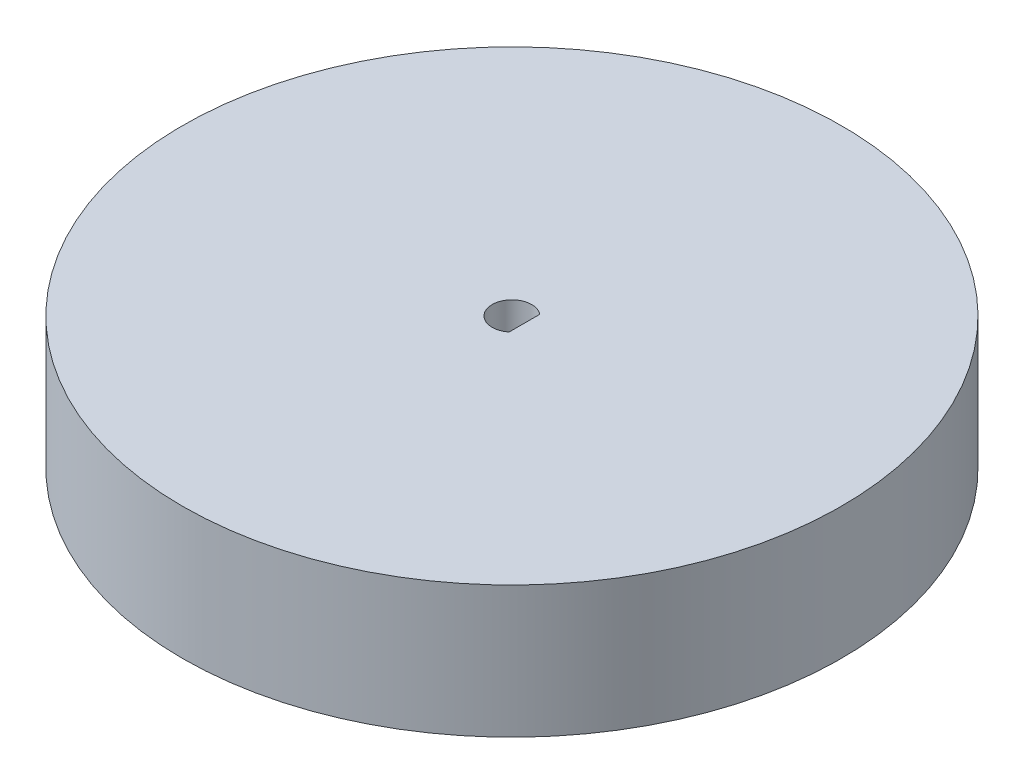
ISO-10303-21;
HEADER;
FILE_DESCRIPTION(('STEP AP214'),'2;1');
FILE_NAME('part.step','',(''),(''),'','','');
FILE_SCHEMA(('AUTOMOTIVE_DESIGN { 1 0 10303 214 1 1 1 1 }'));
ENDSEC;
DATA;
#1=APPLICATION_CONTEXT('core data for automotive mechanical design processes');
#2=APPLICATION_PROTOCOL_DEFINITION('international standard','automotive_design',2000,#1);
#3=PRODUCT_CONTEXT('',#1,'mechanical');
#4=PRODUCT('Part','Part','',(#3));
#5=PRODUCT_RELATED_PRODUCT_CATEGORY('part','',(#4));
#6=PRODUCT_DEFINITION_FORMATION('','',#4);
#7=PRODUCT_DEFINITION_CONTEXT('part definition',#1,'design');
#8=PRODUCT_DEFINITION('design','',#6,#7);
#9=PRODUCT_DEFINITION_SHAPE('','',#8);
#10=(LENGTH_UNIT() NAMED_UNIT(*) SI_UNIT(.MILLI.,.METRE.));
#11=(NAMED_UNIT(*) PLANE_ANGLE_UNIT() SI_UNIT($,.RADIAN.));
#12=(NAMED_UNIT(*) SI_UNIT($,.STERADIAN.) SOLID_ANGLE_UNIT());
#13=UNCERTAINTY_MEASURE_WITH_UNIT(LENGTH_MEASURE(1.E-05),#10,'distance_accuracy_value','');
#14=(GEOMETRIC_REPRESENTATION_CONTEXT(3) GLOBAL_UNCERTAINTY_ASSIGNED_CONTEXT((#13)) GLOBAL_UNIT_ASSIGNED_CONTEXT((#10,
#11,#12)) REPRESENTATION_CONTEXT('',''));
#15=CARTESIAN_POINT('',(0.,0.,0.));
#16=DIRECTION('',(0.,0.,1.));
#17=DIRECTION('',(1.,0.,0.));
#18=AXIS2_PLACEMENT_3D('',#15,#16,#17);
#19=CARTESIAN_POINT('',(0.,10.,0.));
#20=DIRECTION('',(0.,1.,0.));
#21=DIRECTION('',(0.,0.,1.));
#22=AXIS2_PLACEMENT_3D('',#19,#20,#21);
#23=PLANE('',#22);
#24=CARTESIAN_POINT('',(0.,10.,0.));
#25=DIRECTION('',(0.,1.,0.));
#26=DIRECTION('',(0.,0.,1.));
#27=AXIS2_PLACEMENT_3D('',#24,#25,#26);
#28=CIRCLE('',#27,25.);
#29=CARTESIAN_POINT('',(0.,10.,25.));
#30=VERTEX_POINT('',#29);
#31=EDGE_CURVE('E11',#30,#30,#28,.T.);
#32=ORIENTED_EDGE('',*,*,#31,.T.);
#33=EDGE_LOOP('',(#32));
#34=FACE_BOUND('',#33,.T.);
#35=DIRECTION('',(0.,0.,-1.));
#36=VECTOR('',#35,1.);
#37=CARTESIAN_POINT('',(0.950000000000001,10.,-1.16081867662439));
#38=LINE('',#37,#36);
#39=CARTESIAN_POINT('',(0.950000000000001,10.,1.16081867662439));
#40=VERTEX_POINT('',#39);
#41=CARTESIAN_POINT('',(0.950000000000001,10.,-1.16081867662439));
#42=VERTEX_POINT('',#41);
#43=EDGE_CURVE('E90',#40,#42,#38,.T.);
#44=ORIENTED_EDGE('',*,*,#43,.F.);
#45=CARTESIAN_POINT('',(0.,10.,0.));
#46=DIRECTION('',(0.,1.,0.));
#47=DIRECTION('',(0.,0.,1.));
#48=AXIS2_PLACEMENT_3D('',#45,#46,#47);
#49=CIRCLE('',#48,1.5);
#50=EDGE_CURVE('E79',#42,#40,#49,.T.);
#51=ORIENTED_EDGE('',*,*,#50,.F.);
#52=EDGE_LOOP('',(#44,#51));
#53=FACE_BOUND('',#52,.T.);
#54=ADVANCED_FACE('F45',(#34,#53),#23,.T.);
#55=CARTESIAN_POINT('',(0.,0.,0.));
#56=DIRECTION('',(0.,1.,0.));
#57=DIRECTION('',(0.,0.,1.));
#58=AXIS2_PLACEMENT_3D('',#55,#56,#57);
#59=PLANE('',#58);
#60=CARTESIAN_POINT('',(0.,0.,0.));
#61=DIRECTION('',(0.,1.,0.));
#62=DIRECTION('',(0.,0.,1.));
#63=AXIS2_PLACEMENT_3D('',#60,#61,#62);
#64=CIRCLE('',#63,25.);
#65=CARTESIAN_POINT('',(0.,0.,25.));
#66=VERTEX_POINT('',#65);
#67=EDGE_CURVE('E49',#66,#66,#64,.T.);
#68=ORIENTED_EDGE('',*,*,#67,.F.);
#69=EDGE_LOOP('',(#68));
#70=FACE_BOUND('',#69,.T.);
#71=CARTESIAN_POINT('',(0.,0.,0.));
#72=DIRECTION('',(0.,1.,0.));
#73=DIRECTION('',(0.,0.,1.));
#74=AXIS2_PLACEMENT_3D('',#71,#72,#73);
#75=CIRCLE('',#74,1.5);
#76=CARTESIAN_POINT('',(0.950000000000001,0.,-1.16081867662439));
#77=VERTEX_POINT('',#76);
#78=CARTESIAN_POINT('',(0.950000000000001,0.,1.16081867662439));
#79=VERTEX_POINT('',#78);
#80=EDGE_CURVE('E68',#77,#79,#75,.T.);
#81=ORIENTED_EDGE('',*,*,#80,.T.);
#82=DIRECTION('',(0.,0.,-1.));
#83=VECTOR('',#82,1.);
#84=CARTESIAN_POINT('',(0.950000000000001,0.,-1.16081867662439));
#85=LINE('',#84,#83);
#86=EDGE_CURVE('E74',#79,#77,#85,.T.);
#87=ORIENTED_EDGE('',*,*,#86,.T.);
#88=EDGE_LOOP('',(#81,#87));
#89=FACE_BOUND('',#88,.T.);
#90=ADVANCED_FACE('F86',(#70,#89),#59,.F.);
#91=CARTESIAN_POINT('',(0.,10.,0.));
#92=DIRECTION('',(0.,-1.,0.));
#93=DIRECTION('',(0.,0.,-1.));
#94=AXIS2_PLACEMENT_3D('',#91,#92,#93);
#95=CYLINDRICAL_SURFACE('',#94,25.);
#96=ORIENTED_EDGE('',*,*,#31,.F.);
#97=EDGE_LOOP('',(#96));
#98=FACE_BOUND('',#97,.T.);
#99=ORIENTED_EDGE('',*,*,#67,.T.);
#100=EDGE_LOOP('',(#99));
#101=FACE_BOUND('',#100,.T.);
#102=ADVANCED_FACE('F47',(#98,#101),#95,.T.);
#103=CARTESIAN_POINT('',(0.,10.,0.));
#104=DIRECTION('',(0.,-1.,0.));
#105=DIRECTION('',(0.,0.,-1.));
#106=AXIS2_PLACEMENT_3D('',#103,#104,#105);
#107=CYLINDRICAL_SURFACE('',#106,1.5);
#108=ORIENTED_EDGE('',*,*,#80,.F.);
#109=DIRECTION('',(0.,-1.,0.));
#110=VECTOR('',#109,1.);
#111=CARTESIAN_POINT('',(0.950000000000001,10.,-1.16081867662439));
#112=LINE('',#111,#110);
#113=EDGE_CURVE('E76',#42,#77,#112,.T.);
#114=ORIENTED_EDGE('',*,*,#113,.F.);
#115=ORIENTED_EDGE('',*,*,#50,.T.);
#116=DIRECTION('',(0.,-1.,0.));
#117=VECTOR('',#116,1.);
#118=CARTESIAN_POINT('',(0.950000000000001,10.,1.16081867662439));
#119=LINE('',#118,#117);
#120=EDGE_CURVE('E61',#40,#79,#119,.T.);
#121=ORIENTED_EDGE('',*,*,#120,.T.);
#122=EDGE_LOOP('',(#108,#114,#115,#121));
#123=FACE_BOUND('',#122,.T.);
#124=ADVANCED_FACE('F81',(#123),#107,.F.);
#125=CARTESIAN_POINT('',(0.950000000000001,10.,-1.16081867662439));
#126=DIRECTION('',(-1.,0.,0.));
#127=DIRECTION('',(0.,0.,1.));
#128=AXIS2_PLACEMENT_3D('',#125,#126,#127);
#129=PLANE('',#128);
#130=ORIENTED_EDGE('',*,*,#86,.F.);
#131=ORIENTED_EDGE('',*,*,#120,.F.);
#132=ORIENTED_EDGE('',*,*,#43,.T.);
#133=ORIENTED_EDGE('',*,*,#113,.T.);
#134=EDGE_LOOP('',(#130,#131,#132,#133));
#135=FACE_BOUND('',#134,.T.);
#136=ADVANCED_FACE('F75',(#135),#129,.T.);
#137=CLOSED_SHELL('',(#54,#90,#102,#124,#136));
#138=MANIFOLD_SOLID_BREP('B2',#137);
#139=ADVANCED_BREP_SHAPE_REPRESENTATION('',(#18,#138),#14);
#140=SHAPE_DEFINITION_REPRESENTATION(#9,#139);
ENDSEC;
END-ISO-10303-21;
